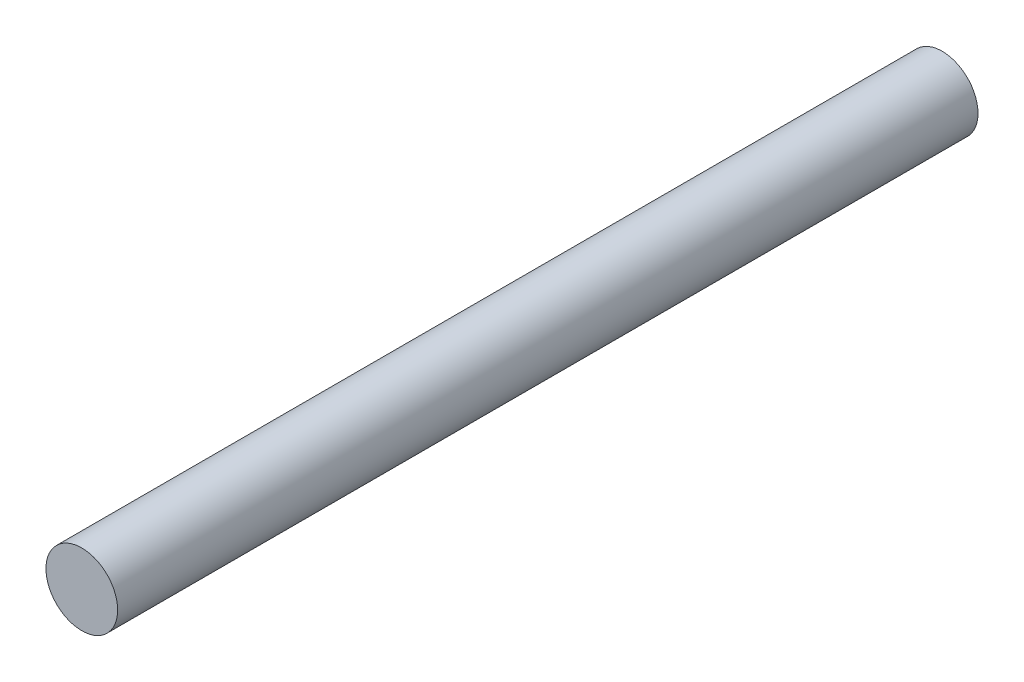
ISO-10303-21;
HEADER;
FILE_DESCRIPTION(('STEP AP214'),'2;1');
FILE_NAME('part.step','',(''),(''),'','','');
FILE_SCHEMA(('AUTOMOTIVE_DESIGN { 1 0 10303 214 1 1 1 1 }'));
ENDSEC;
DATA;
#1=APPLICATION_CONTEXT('core data for automotive mechanical design processes');
#2=APPLICATION_PROTOCOL_DEFINITION('international standard','automotive_design',2000,#1);
#3=PRODUCT_CONTEXT('',#1,'mechanical');
#4=PRODUCT('Part','Part','',(#3));
#5=PRODUCT_RELATED_PRODUCT_CATEGORY('part','',(#4));
#6=PRODUCT_DEFINITION_FORMATION('','',#4);
#7=PRODUCT_DEFINITION_CONTEXT('part definition',#1,'design');
#8=PRODUCT_DEFINITION('design','',#6,#7);
#9=PRODUCT_DEFINITION_SHAPE('','',#8);
#10=(LENGTH_UNIT() NAMED_UNIT(*) SI_UNIT(.MILLI.,.METRE.));
#11=(NAMED_UNIT(*) PLANE_ANGLE_UNIT() SI_UNIT($,.RADIAN.));
#12=(NAMED_UNIT(*) SI_UNIT($,.STERADIAN.) SOLID_ANGLE_UNIT());
#13=UNCERTAINTY_MEASURE_WITH_UNIT(LENGTH_MEASURE(1.E-05),#10,'distance_accuracy_value','');
#14=(GEOMETRIC_REPRESENTATION_CONTEXT(3) GLOBAL_UNCERTAINTY_ASSIGNED_CONTEXT((#13)) GLOBAL_UNIT_ASSIGNED_CONTEXT((#10,
#11,#12)) REPRESENTATION_CONTEXT('',''));
#15=CARTESIAN_POINT('',(0.,0.,0.));
#16=DIRECTION('',(0.,0.,1.));
#17=DIRECTION('',(1.,0.,0.));
#18=AXIS2_PLACEMENT_3D('',#15,#16,#17);
#19=CARTESIAN_POINT('',(0.,0.,60.));
#20=DIRECTION('',(0.,0.,-1.));
#21=DIRECTION('',(-1.,0.,0.));
#22=AXIS2_PLACEMENT_3D('',#19,#20,#21);
#23=CYLINDRICAL_SURFACE('',#22,2.5);
#24=CARTESIAN_POINT('',(0.,0.,60.));
#25=DIRECTION('',(0.,0.,1.));
#26=DIRECTION('',(1.,0.,0.));
#27=AXIS2_PLACEMENT_3D('',#24,#25,#26);
#28=CIRCLE('',#27,2.5);
#29=CARTESIAN_POINT('',(2.5,0.,60.));
#30=VERTEX_POINT('',#29);
#31=EDGE_CURVE('E10',#30,#30,#28,.T.);
#32=ORIENTED_EDGE('',*,*,#31,.F.);
#33=EDGE_LOOP('',(#32));
#34=FACE_BOUND('',#33,.T.);
#35=CARTESIAN_POINT('',(0.,0.,0.));
#36=DIRECTION('',(0.,0.,1.));
#37=DIRECTION('',(1.,0.,0.));
#38=AXIS2_PLACEMENT_3D('',#35,#36,#37);
#39=CIRCLE('',#38,2.5);
#40=CARTESIAN_POINT('',(2.5,0.,0.));
#41=VERTEX_POINT('',#40);
#42=EDGE_CURVE('E36',#41,#41,#39,.T.);
#43=ORIENTED_EDGE('',*,*,#42,.T.);
#44=EDGE_LOOP('',(#43));
#45=FACE_BOUND('',#44,.T.);
#46=ADVANCED_FACE('F33',(#34,#45),#23,.T.);
#47=CARTESIAN_POINT('',(0.,0.,60.));
#48=DIRECTION('',(0.,0.,1.));
#49=DIRECTION('',(1.,0.,0.));
#50=AXIS2_PLACEMENT_3D('',#47,#48,#49);
#51=PLANE('',#50);
#52=ORIENTED_EDGE('',*,*,#31,.T.);
#53=EDGE_LOOP('',(#52));
#54=FACE_BOUND('',#53,.T.);
#55=ADVANCED_FACE('F48',(#54),#51,.T.);
#56=CARTESIAN_POINT('',(0.,0.,0.));
#57=DIRECTION('',(0.,0.,1.));
#58=DIRECTION('',(1.,0.,0.));
#59=AXIS2_PLACEMENT_3D('',#56,#57,#58);
#60=PLANE('',#59);
#61=ORIENTED_EDGE('',*,*,#42,.F.);
#62=EDGE_LOOP('',(#61));
#63=FACE_BOUND('',#62,.T.);
#64=ADVANCED_FACE('F46',(#63),#60,.F.);
#65=CLOSED_SHELL('',(#46,#55,#64));
#66=MANIFOLD_SOLID_BREP('B2',#65);
#67=ADVANCED_BREP_SHAPE_REPRESENTATION('',(#18,#66),#14);
#68=SHAPE_DEFINITION_REPRESENTATION(#9,#67);
ENDSEC;
END-ISO-10303-21;
